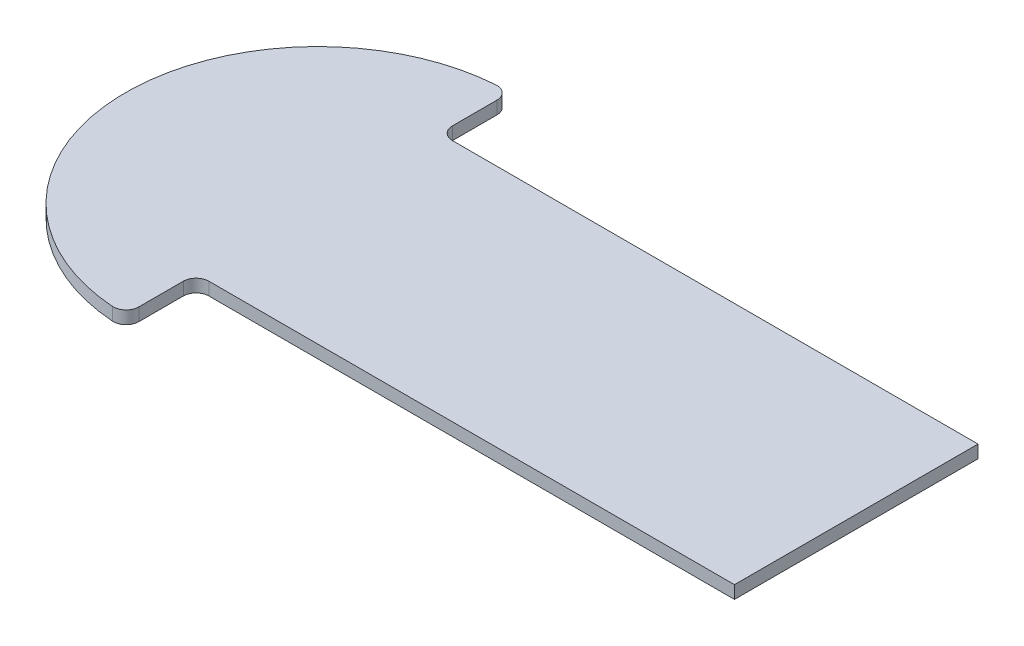
ISO-10303-21;
HEADER;
FILE_DESCRIPTION(('STEP AP214'),'2;1');
FILE_NAME('part.step','',(''),(''),'','','');
FILE_SCHEMA(('AUTOMOTIVE_DESIGN { 1 0 10303 214 1 1 1 1 }'));
ENDSEC;
DATA;
#1=APPLICATION_CONTEXT('core data for automotive mechanical design processes');
#2=APPLICATION_PROTOCOL_DEFINITION('international standard','automotive_design',2000,#1);
#3=PRODUCT_CONTEXT('',#1,'mechanical');
#4=PRODUCT('Part','Part','',(#3));
#5=PRODUCT_RELATED_PRODUCT_CATEGORY('part','',(#4));
#6=PRODUCT_DEFINITION_FORMATION('','',#4);
#7=PRODUCT_DEFINITION_CONTEXT('part definition',#1,'design');
#8=PRODUCT_DEFINITION('design','',#6,#7);
#9=PRODUCT_DEFINITION_SHAPE('','',#8);
#10=(LENGTH_UNIT() NAMED_UNIT(*) SI_UNIT(.MILLI.,.METRE.));
#11=(NAMED_UNIT(*) PLANE_ANGLE_UNIT() SI_UNIT($,.RADIAN.));
#12=(NAMED_UNIT(*) SI_UNIT($,.STERADIAN.) SOLID_ANGLE_UNIT());
#13=UNCERTAINTY_MEASURE_WITH_UNIT(LENGTH_MEASURE(1.E-05),#10,'distance_accuracy_value','');
#14=(GEOMETRIC_REPRESENTATION_CONTEXT(3) GLOBAL_UNCERTAINTY_ASSIGNED_CONTEXT((#13)) GLOBAL_UNIT_ASSIGNED_CONTEXT((#10,
#11,#12)) REPRESENTATION_CONTEXT('',''));
#15=CARTESIAN_POINT('',(0.,0.,0.));
#16=DIRECTION('',(0.,0.,1.));
#17=DIRECTION('',(1.,0.,0.));
#18=AXIS2_PLACEMENT_3D('',#15,#16,#17);
#19=CARTESIAN_POINT('',(-21.,1.,0.));
#20=DIRECTION('',(1.,0.,0.));
#21=DIRECTION('',(0.,0.,-1.));
#22=AXIS2_PLACEMENT_3D('',#19,#20,#21);
#23=PLANE('',#22);
#24=DIRECTION('',(0.,0.,1.));
#25=VECTOR('',#24,1.);
#26=CARTESIAN_POINT('',(-21.,1.,0.));
#27=LINE('',#26,#25);
#28=CARTESIAN_POINT('',(-21.,1.,-13.9642400437689));
#29=VERTEX_POINT('',#28);
#30=CARTESIAN_POINT('',(-21.,1.,-10.5));
#31=VERTEX_POINT('',#30);
#32=EDGE_CURVE('E155',#29,#31,#27,.T.);
#33=ORIENTED_EDGE('',*,*,#32,.T.);
#34=DIRECTION('',(0.,-1.,0.));
#35=VECTOR('',#34,1.);
#36=CARTESIAN_POINT('',(-21.,1.,-10.5));
#37=LINE('',#36,#35);
#38=CARTESIAN_POINT('',(-21.,0.,-10.5));
#39=VERTEX_POINT('',#38);
#40=EDGE_CURVE('E191',#31,#39,#37,.T.);
#41=ORIENTED_EDGE('',*,*,#40,.T.);
#42=DIRECTION('',(0.,0.,1.));
#43=VECTOR('',#42,1.);
#44=CARTESIAN_POINT('',(-21.,0.,0.));
#45=LINE('',#44,#43);
#46=CARTESIAN_POINT('',(-21.,0.,-13.9642400437689));
#47=VERTEX_POINT('',#46);
#48=EDGE_CURVE('E160',#47,#39,#45,.T.);
#49=ORIENTED_EDGE('',*,*,#48,.F.);
#50=DIRECTION('',(0.,1.,0.));
#51=VECTOR('',#50,1.);
#52=CARTESIAN_POINT('',(-21.,1.,-13.9642400437689));
#53=LINE('',#52,#51);
#54=EDGE_CURVE('E188',#47,#29,#53,.T.);
#55=ORIENTED_EDGE('',*,*,#54,.T.);
#56=EDGE_LOOP('',(#33,#41,#49,#55));
#57=FACE_BOUND('',#56,.T.);
#58=ADVANCED_FACE('F41',(#57),#23,.T.);
#59=CARTESIAN_POINT('',(-21.,1.,0.));
#60=DIRECTION('',(0.,-1.,0.));
#61=DIRECTION('',(0.,0.,-1.));
#62=AXIS2_PLACEMENT_3D('',#59,#60,#61);
#63=CYLINDRICAL_SURFACE('',#62,15.);
#64=CARTESIAN_POINT('',(-21.,1.,0.));
#65=DIRECTION('',(0.,1.,0.));
#66=DIRECTION('',(0.,0.,1.));
#67=AXIS2_PLACEMENT_3D('',#64,#65,#66);
#68=CIRCLE('',#67,15.);
#69=CARTESIAN_POINT('',(-22.0714285714286,1.,-14.961685761181));
#70=VERTEX_POINT('',#69);
#71=CARTESIAN_POINT('',(-22.0714285714285,1.,14.961685761181));
#72=VERTEX_POINT('',#71);
#73=EDGE_CURVE('E153',#70,#72,#68,.T.);
#74=ORIENTED_EDGE('',*,*,#73,.F.);
#75=DIRECTION('',(0.,-1.,0.));
#76=VECTOR('',#75,1.);
#77=CARTESIAN_POINT('',(-22.0714285714286,1.,-14.961685761181));
#78=LINE('',#77,#76);
#79=CARTESIAN_POINT('',(-22.0714285714286,0.,-14.961685761181));
#80=VERTEX_POINT('',#79);
#81=EDGE_CURVE('E200',#70,#80,#78,.T.);
#82=ORIENTED_EDGE('',*,*,#81,.T.);
#83=CARTESIAN_POINT('',(-21.,0.,0.));
#84=DIRECTION('',(0.,1.,0.));
#85=DIRECTION('',(0.,0.,1.));
#86=AXIS2_PLACEMENT_3D('',#83,#84,#85);
#87=CIRCLE('',#86,15.);
#88=CARTESIAN_POINT('',(-22.0714285714285,0.,14.961685761181));
#89=VERTEX_POINT('',#88);
#90=EDGE_CURVE('E164',#80,#89,#87,.T.);
#91=ORIENTED_EDGE('',*,*,#90,.T.);
#92=DIRECTION('',(0.,-1.,0.));
#93=VECTOR('',#92,1.);
#94=CARTESIAN_POINT('',(-22.0714285714285,1.,14.961685761181));
#95=LINE('',#94,#93);
#96=EDGE_CURVE('E57',#89,#72,#95,.F.);
#97=ORIENTED_EDGE('',*,*,#96,.T.);
#98=EDGE_LOOP('',(#74,#82,#91,#97));
#99=FACE_BOUND('',#98,.T.);
#100=ADVANCED_FACE('F260',(#99),#63,.T.);
#101=CARTESIAN_POINT('',(-21.,0.,10.5));
#102=VERTEX_POINT('',#101);
#103=CARTESIAN_POINT('',(-21.,0.,13.9642400437689));
#104=VERTEX_POINT('',#103);
#105=EDGE_CURVE('E165',#102,#104,#45,.T.);
#106=ORIENTED_EDGE('',*,*,#105,.F.);
#107=DIRECTION('',(0.,-1.,0.));
#108=VECTOR('',#107,1.);
#109=CARTESIAN_POINT('',(-21.,1.,10.5));
#110=LINE('',#109,#108);
#111=CARTESIAN_POINT('',(-21.,1.,10.5));
#112=VERTEX_POINT('',#111);
#113=EDGE_CURVE('E185',#102,#112,#110,.F.);
#114=ORIENTED_EDGE('',*,*,#113,.T.);
#115=CARTESIAN_POINT('',(-21.,1.,13.9642400437689));
#116=VERTEX_POINT('',#115);
#117=EDGE_CURVE('E149',#112,#116,#27,.T.);
#118=ORIENTED_EDGE('',*,*,#117,.T.);
#119=DIRECTION('',(0.,1.,0.));
#120=VECTOR('',#119,1.);
#121=CARTESIAN_POINT('',(-21.,0.,13.9642400437689));
#122=LINE('',#121,#120);
#123=EDGE_CURVE('E181',#116,#104,#122,.F.);
#124=ORIENTED_EDGE('',*,*,#123,.T.);
#125=EDGE_LOOP('',(#106,#114,#118,#124));
#126=FACE_BOUND('',#125,.T.);
#127=ADVANCED_FACE('F244',(#126),#23,.T.);
#128=CARTESIAN_POINT('',(0.,1.,9.5));
#129=DIRECTION('',(0.,0.,1.));
#130=DIRECTION('',(1.,0.,0.));
#131=AXIS2_PLACEMENT_3D('',#128,#129,#130);
#132=PLANE('',#131);
#133=DIRECTION('',(-1.,0.,0.));
#134=VECTOR('',#133,1.);
#135=CARTESIAN_POINT('',(0.,1.,9.5));
#136=LINE('',#135,#134);
#137=CARTESIAN_POINT('',(21.,1.,9.5));
#138=VERTEX_POINT('',#137);
#139=CARTESIAN_POINT('',(-20.,1.,9.50000000000001));
#140=VERTEX_POINT('',#139);
#141=EDGE_CURVE('E125',#138,#140,#136,.T.);
#142=ORIENTED_EDGE('',*,*,#141,.T.);
#143=DIRECTION('',(0.,-1.,0.));
#144=VECTOR('',#143,1.);
#145=CARTESIAN_POINT('',(-20.,0.,9.50000000000001));
#146=LINE('',#145,#144);
#147=CARTESIAN_POINT('',(-20.,0.,9.50000000000001));
#148=VERTEX_POINT('',#147);
#149=EDGE_CURVE('E132',#140,#148,#146,.T.);
#150=ORIENTED_EDGE('',*,*,#149,.T.);
#151=DIRECTION('',(-1.,0.,0.));
#152=VECTOR('',#151,1.);
#153=CARTESIAN_POINT('',(0.,0.,9.5));
#154=LINE('',#153,#152);
#155=CARTESIAN_POINT('',(21.,0.,9.5));
#156=VERTEX_POINT('',#155);
#157=EDGE_CURVE('E128',#156,#148,#154,.T.);
#158=ORIENTED_EDGE('',*,*,#157,.F.);
#159=DIRECTION('',(0.,-1.,0.));
#160=VECTOR('',#159,1.);
#161=CARTESIAN_POINT('',(21.,1.,9.5));
#162=LINE('',#161,#160);
#163=EDGE_CURVE('E120',#138,#156,#162,.T.);
#164=ORIENTED_EDGE('',*,*,#163,.F.);
#165=EDGE_LOOP('',(#142,#150,#158,#164));
#166=FACE_BOUND('',#165,.T.);
#167=ADVANCED_FACE('F122',(#166),#132,.T.);
#168=CARTESIAN_POINT('',(21.,1.,0.));
#169=DIRECTION('',(-1.,0.,0.));
#170=DIRECTION('',(0.,0.,1.));
#171=AXIS2_PLACEMENT_3D('',#168,#169,#170);
#172=PLANE('',#171);
#173=DIRECTION('',(0.,0.,-1.));
#174=VECTOR('',#173,1.);
#175=CARTESIAN_POINT('',(21.,0.,0.));
#176=LINE('',#175,#174);
#177=CARTESIAN_POINT('',(21.,0.,-9.5));
#178=VERTEX_POINT('',#177);
#179=EDGE_CURVE('E170',#156,#178,#176,.T.);
#180=ORIENTED_EDGE('',*,*,#179,.T.);
#181=DIRECTION('',(0.,-1.,0.));
#182=VECTOR('',#181,1.);
#183=CARTESIAN_POINT('',(21.,1.,-9.5));
#184=LINE('',#183,#182);
#185=CARTESIAN_POINT('',(21.,1.,-9.5));
#186=VERTEX_POINT('',#185);
#187=EDGE_CURVE('E133',#186,#178,#184,.T.);
#188=ORIENTED_EDGE('',*,*,#187,.F.);
#189=DIRECTION('',(0.,0.,-1.));
#190=VECTOR('',#189,1.);
#191=CARTESIAN_POINT('',(21.,1.,0.));
#192=LINE('',#191,#190);
#193=EDGE_CURVE('E136',#138,#186,#192,.T.);
#194=ORIENTED_EDGE('',*,*,#193,.F.);
#195=ORIENTED_EDGE('',*,*,#163,.T.);
#196=EDGE_LOOP('',(#180,#188,#194,#195));
#197=FACE_BOUND('',#196,.T.);
#198=ADVANCED_FACE('F137',(#197),#172,.F.);
#199=CARTESIAN_POINT('',(0.,1.,-9.5));
#200=DIRECTION('',(0.,0.,1.));
#201=DIRECTION('',(1.,0.,0.));
#202=AXIS2_PLACEMENT_3D('',#199,#200,#201);
#203=PLANE('',#202);
#204=DIRECTION('',(-1.,0.,0.));
#205=VECTOR('',#204,1.);
#206=CARTESIAN_POINT('',(0.,0.,-9.5));
#207=LINE('',#206,#205);
#208=CARTESIAN_POINT('',(-20.,0.,-9.49999999999999));
#209=VERTEX_POINT('',#208);
#210=EDGE_CURVE('E173',#178,#209,#207,.T.);
#211=ORIENTED_EDGE('',*,*,#210,.T.);
#212=DIRECTION('',(0.,-1.,0.));
#213=VECTOR('',#212,1.);
#214=CARTESIAN_POINT('',(-20.,1.,-9.49999999999999));
#215=LINE('',#214,#213);
#216=CARTESIAN_POINT('',(-20.,1.,-9.49999999999999));
#217=VERTEX_POINT('',#216);
#218=EDGE_CURVE('E195',#209,#217,#215,.F.);
#219=ORIENTED_EDGE('',*,*,#218,.T.);
#220=DIRECTION('',(-1.,0.,0.));
#221=VECTOR('',#220,1.);
#222=CARTESIAN_POINT('',(0.,1.,-9.5));
#223=LINE('',#222,#221);
#224=EDGE_CURVE('E142',#186,#217,#223,.T.);
#225=ORIENTED_EDGE('',*,*,#224,.F.);
#226=ORIENTED_EDGE('',*,*,#187,.T.);
#227=EDGE_LOOP('',(#211,#219,#225,#226));
#228=FACE_BOUND('',#227,.T.);
#229=ADVANCED_FACE('F229',(#228),#203,.F.);
#230=CARTESIAN_POINT('',(0.,1.,0.));
#231=DIRECTION('',(0.,1.,0.));
#232=DIRECTION('',(0.,0.,1.));
#233=AXIS2_PLACEMENT_3D('',#230,#231,#232);
#234=PLANE('',#233);
#235=ORIENTED_EDGE('',*,*,#32,.F.);
#236=CARTESIAN_POINT('',(-22.,1.,-13.9642400437689));
#237=DIRECTION('',(0.,1.,0.));
#238=DIRECTION('',(0.,0.,1.));
#239=AXIS2_PLACEMENT_3D('',#236,#237,#238);
#240=CIRCLE('',#239,1.);
#241=EDGE_CURVE('E64',#29,#70,#240,.T.);
#242=ORIENTED_EDGE('',*,*,#241,.T.);
#243=ORIENTED_EDGE('',*,*,#73,.T.);
#244=CARTESIAN_POINT('',(-22.,1.,13.9642400437689));
#245=DIRECTION('',(0.,1.,0.));
#246=DIRECTION('',(0.,0.,1.));
#247=AXIS2_PLACEMENT_3D('',#244,#245,#246);
#248=CIRCLE('',#247,1.);
#249=EDGE_CURVE('E210',#72,#116,#248,.T.);
#250=ORIENTED_EDGE('',*,*,#249,.T.);
#251=ORIENTED_EDGE('',*,*,#117,.F.);
#252=CARTESIAN_POINT('',(-20.,1.,10.5));
#253=DIRECTION('',(0.,1.,0.));
#254=DIRECTION('',(0.,0.,1.));
#255=AXIS2_PLACEMENT_3D('',#252,#253,#254);
#256=CIRCLE('',#255,1.);
#257=EDGE_CURVE('E147',#112,#140,#256,.F.);
#258=ORIENTED_EDGE('',*,*,#257,.T.);
#259=ORIENTED_EDGE('',*,*,#141,.F.);
#260=ORIENTED_EDGE('',*,*,#193,.T.);
#261=ORIENTED_EDGE('',*,*,#224,.T.);
#262=CARTESIAN_POINT('',(-20.,1.,-10.5));
#263=DIRECTION('',(0.,1.,0.));
#264=DIRECTION('',(0.,0.,1.));
#265=AXIS2_PLACEMENT_3D('',#262,#263,#264);
#266=CIRCLE('',#265,1.);
#267=EDGE_CURVE('E11',#217,#31,#266,.F.);
#268=ORIENTED_EDGE('',*,*,#267,.T.);
#269=EDGE_LOOP('',(#235,#242,#243,#250,#251,#258,#259,#260,#261,#268));
#270=FACE_BOUND('',#269,.T.);
#271=ADVANCED_FACE('F144',(#270),#234,.T.);
#272=CARTESIAN_POINT('',(0.,0.,0.));
#273=DIRECTION('',(0.,1.,0.));
#274=DIRECTION('',(0.,0.,1.));
#275=AXIS2_PLACEMENT_3D('',#272,#273,#274);
#276=PLANE('',#275);
#277=ORIENTED_EDGE('',*,*,#90,.F.);
#278=CARTESIAN_POINT('',(-22.,0.,-13.9642400437689));
#279=DIRECTION('',(0.,1.,0.));
#280=DIRECTION('',(0.,0.,1.));
#281=AXIS2_PLACEMENT_3D('',#278,#279,#280);
#282=CIRCLE('',#281,1.);
#283=EDGE_CURVE('E207',#80,#47,#282,.F.);
#284=ORIENTED_EDGE('',*,*,#283,.T.);
#285=ORIENTED_EDGE('',*,*,#48,.T.);
#286=CARTESIAN_POINT('',(-20.,0.,-10.5));
#287=DIRECTION('',(0.,1.,0.));
#288=DIRECTION('',(0.,0.,1.));
#289=AXIS2_PLACEMENT_3D('',#286,#287,#288);
#290=CIRCLE('',#289,1.);
#291=EDGE_CURVE('E50',#39,#209,#290,.T.);
#292=ORIENTED_EDGE('',*,*,#291,.T.);
#293=ORIENTED_EDGE('',*,*,#210,.F.);
#294=ORIENTED_EDGE('',*,*,#179,.F.);
#295=ORIENTED_EDGE('',*,*,#157,.T.);
#296=CARTESIAN_POINT('',(-20.,0.,10.5));
#297=DIRECTION('',(0.,1.,0.));
#298=DIRECTION('',(0.,0.,1.));
#299=AXIS2_PLACEMENT_3D('',#296,#297,#298);
#300=CIRCLE('',#299,1.);
#301=EDGE_CURVE('E215',#148,#102,#300,.T.);
#302=ORIENTED_EDGE('',*,*,#301,.T.);
#303=ORIENTED_EDGE('',*,*,#105,.T.);
#304=CARTESIAN_POINT('',(-22.,0.,13.9642400437689));
#305=DIRECTION('',(0.,1.,0.));
#306=DIRECTION('',(0.,0.,1.));
#307=AXIS2_PLACEMENT_3D('',#304,#305,#306);
#308=CIRCLE('',#307,1.);
#309=EDGE_CURVE('E204',#104,#89,#308,.F.);
#310=ORIENTED_EDGE('',*,*,#309,.T.);
#311=EDGE_LOOP('',(#277,#284,#285,#292,#293,#294,#295,#302,#303,#310));
#312=FACE_BOUND('',#311,.T.);
#313=ADVANCED_FACE('F223',(#312),#276,.F.);
#314=CARTESIAN_POINT('',(-20.,1.,10.5));
#315=DIRECTION('',(0.,1.,0.));
#316=DIRECTION('',(0.,0.,1.));
#317=AXIS2_PLACEMENT_3D('',#314,#315,#316);
#318=CYLINDRICAL_SURFACE('',#317,1.);
#319=ORIENTED_EDGE('',*,*,#257,.F.);
#320=ORIENTED_EDGE('',*,*,#113,.F.);
#321=ORIENTED_EDGE('',*,*,#301,.F.);
#322=ORIENTED_EDGE('',*,*,#149,.F.);
#323=EDGE_LOOP('',(#319,#320,#321,#322));
#324=FACE_BOUND('',#323,.T.);
#325=ADVANCED_FACE('F248',(#324),#318,.F.);
#326=CARTESIAN_POINT('',(-20.,1.,-10.5));
#327=DIRECTION('',(0.,-1.,0.));
#328=DIRECTION('',(0.,0.,-1.));
#329=AXIS2_PLACEMENT_3D('',#326,#327,#328);
#330=CYLINDRICAL_SURFACE('',#329,1.);
#331=ORIENTED_EDGE('',*,*,#267,.F.);
#332=ORIENTED_EDGE('',*,*,#218,.F.);
#333=ORIENTED_EDGE('',*,*,#291,.F.);
#334=ORIENTED_EDGE('',*,*,#40,.F.);
#335=EDGE_LOOP('',(#331,#332,#333,#334));
#336=FACE_BOUND('',#335,.T.);
#337=ADVANCED_FACE('F231',(#336),#330,.F.);
#338=CARTESIAN_POINT('',(-22.,1.,-13.9642400437689));
#339=DIRECTION('',(0.,-1.,0.));
#340=DIRECTION('',(0.,0.,-1.));
#341=AXIS2_PLACEMENT_3D('',#338,#339,#340);
#342=CYLINDRICAL_SURFACE('',#341,1.);
#343=ORIENTED_EDGE('',*,*,#241,.F.);
#344=ORIENTED_EDGE('',*,*,#54,.F.);
#345=ORIENTED_EDGE('',*,*,#283,.F.);
#346=ORIENTED_EDGE('',*,*,#81,.F.);
#347=EDGE_LOOP('',(#343,#344,#345,#346));
#348=FACE_BOUND('',#347,.T.);
#349=ADVANCED_FACE('F255',(#348),#342,.T.);
#350=CARTESIAN_POINT('',(-22.,1.,13.9642400437689));
#351=DIRECTION('',(0.,-1.,0.));
#352=DIRECTION('',(0.,0.,-1.));
#353=AXIS2_PLACEMENT_3D('',#350,#351,#352);
#354=CYLINDRICAL_SURFACE('',#353,1.);
#355=ORIENTED_EDGE('',*,*,#249,.F.);
#356=ORIENTED_EDGE('',*,*,#96,.F.);
#357=ORIENTED_EDGE('',*,*,#309,.F.);
#358=ORIENTED_EDGE('',*,*,#123,.F.);
#359=EDGE_LOOP('',(#355,#356,#357,#358));
#360=FACE_BOUND('',#359,.T.);
#361=ADVANCED_FACE('F43',(#360),#354,.T.);
#362=CLOSED_SHELL('',(#58,#100,#127,#167,#198,#229,#271,#313,#325,#337,#349,#361));
#363=MANIFOLD_SOLID_BREP('B2',#362);
#364=ADVANCED_BREP_SHAPE_REPRESENTATION('',(#18,#363),#14);
#365=SHAPE_DEFINITION_REPRESENTATION(#9,#364);
ENDSEC;
END-ISO-10303-21;
